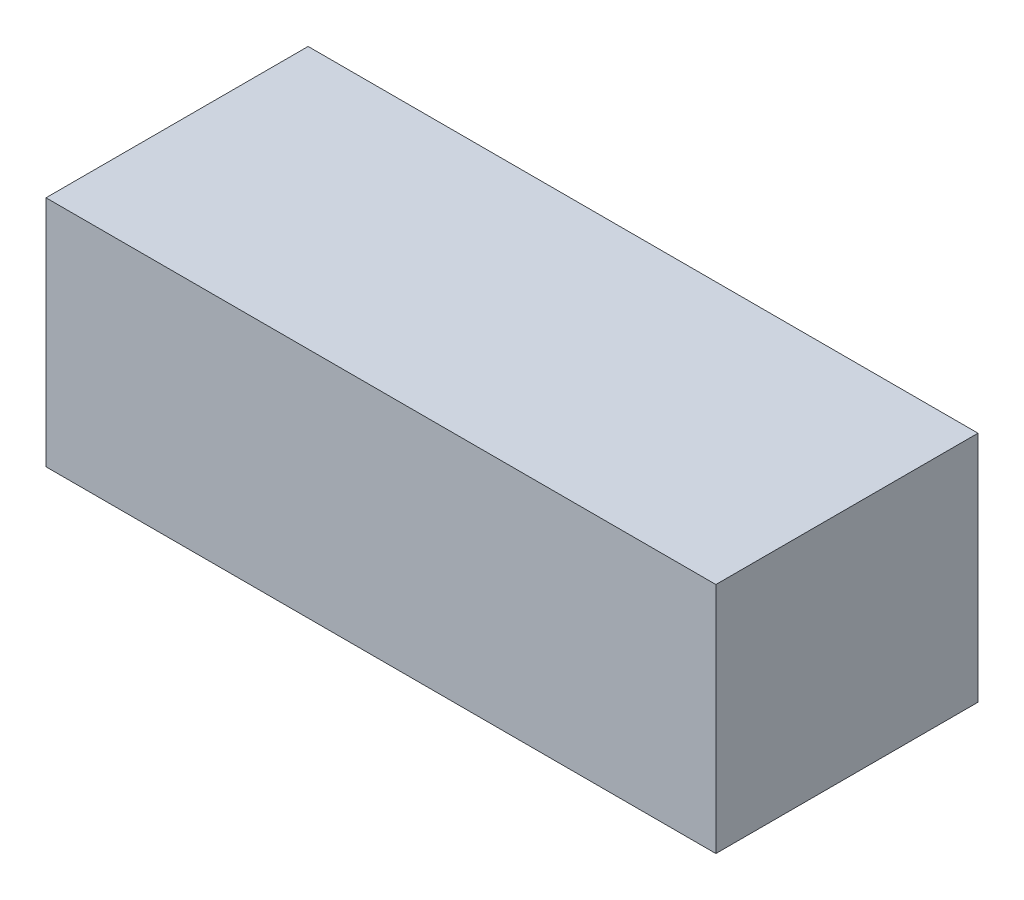
ISO-10303-21;
HEADER;
FILE_DESCRIPTION(('STEP AP214'),'2;1');
FILE_NAME('part.step','',(''),(''),'','','');
FILE_SCHEMA(('AUTOMOTIVE_DESIGN { 1 0 10303 214 1 1 1 1 }'));
ENDSEC;
DATA;
#1=APPLICATION_CONTEXT('core data for automotive mechanical design processes');
#2=APPLICATION_PROTOCOL_DEFINITION('international standard','automotive_design',2000,#1);
#3=PRODUCT_CONTEXT('',#1,'mechanical');
#4=PRODUCT('Part','Part','',(#3));
#5=PRODUCT_RELATED_PRODUCT_CATEGORY('part','',(#4));
#6=PRODUCT_DEFINITION_FORMATION('','',#4);
#7=PRODUCT_DEFINITION_CONTEXT('part definition',#1,'design');
#8=PRODUCT_DEFINITION('design','',#6,#7);
#9=PRODUCT_DEFINITION_SHAPE('','',#8);
#10=(LENGTH_UNIT() NAMED_UNIT(*) SI_UNIT(.MILLI.,.METRE.));
#11=(NAMED_UNIT(*) PLANE_ANGLE_UNIT() SI_UNIT($,.RADIAN.));
#12=(NAMED_UNIT(*) SI_UNIT($,.STERADIAN.) SOLID_ANGLE_UNIT());
#13=UNCERTAINTY_MEASURE_WITH_UNIT(LENGTH_MEASURE(1.E-05),#10,'distance_accuracy_value','');
#14=(GEOMETRIC_REPRESENTATION_CONTEXT(3) GLOBAL_UNCERTAINTY_ASSIGNED_CONTEXT((#13)) GLOBAL_UNIT_ASSIGNED_CONTEXT((#10,
#11,#12)) REPRESENTATION_CONTEXT('',''));
#15=CARTESIAN_POINT('',(0.,0.,0.));
#16=DIRECTION('',(0.,0.,1.));
#17=DIRECTION('',(1.,0.,0.));
#18=AXIS2_PLACEMENT_3D('',#15,#16,#17);
#19=CARTESIAN_POINT('',(-23.,16.,-9.));
#20=DIRECTION('',(1.,0.,0.));
#21=DIRECTION('',(0.,0.,-1.));
#22=AXIS2_PLACEMENT_3D('',#19,#20,#21);
#23=PLANE('',#22);
#24=DIRECTION('',(0.,0.,1.));
#25=VECTOR('',#24,1.);
#26=CARTESIAN_POINT('',(-23.,0.,-9.));
#27=LINE('',#26,#25);
#28=CARTESIAN_POINT('',(-23.,0.,-9.));
#29=VERTEX_POINT('',#28);
#30=CARTESIAN_POINT('',(-23.,0.,9.));
#31=VERTEX_POINT('',#30);
#32=EDGE_CURVE('E113',#29,#31,#27,.T.);
#33=ORIENTED_EDGE('',*,*,#32,.T.);
#34=DIRECTION('',(0.,-1.,0.));
#35=VECTOR('',#34,1.);
#36=CARTESIAN_POINT('',(-23.,16.,9.));
#37=LINE('',#36,#35);
#38=CARTESIAN_POINT('',(-23.,16.,9.));
#39=VERTEX_POINT('',#38);
#40=EDGE_CURVE('E11',#39,#31,#37,.T.);
#41=ORIENTED_EDGE('',*,*,#40,.F.);
#42=DIRECTION('',(0.,0.,1.));
#43=VECTOR('',#42,1.);
#44=CARTESIAN_POINT('',(-23.,16.,-9.));
#45=LINE('',#44,#43);
#46=CARTESIAN_POINT('',(-23.,16.,-9.));
#47=VERTEX_POINT('',#46);
#48=EDGE_CURVE('E97',#47,#39,#45,.T.);
#49=ORIENTED_EDGE('',*,*,#48,.F.);
#50=DIRECTION('',(0.,-1.,0.));
#51=VECTOR('',#50,1.);
#52=CARTESIAN_POINT('',(-23.,16.,-9.));
#53=LINE('',#52,#51);
#54=EDGE_CURVE('E109',#47,#29,#53,.T.);
#55=ORIENTED_EDGE('',*,*,#54,.T.);
#56=EDGE_LOOP('',(#33,#41,#49,#55));
#57=FACE_BOUND('',#56,.T.);
#58=ADVANCED_FACE('F45',(#57),#23,.F.);
#59=CARTESIAN_POINT('',(-23.,16.,9.));
#60=DIRECTION('',(0.,0.,-1.));
#61=DIRECTION('',(-1.,0.,0.));
#62=AXIS2_PLACEMENT_3D('',#59,#60,#61);
#63=PLANE('',#62);
#64=DIRECTION('',(1.,0.,0.));
#65=VECTOR('',#64,1.);
#66=CARTESIAN_POINT('',(-23.,0.,9.));
#67=LINE('',#66,#65);
#68=CARTESIAN_POINT('',(23.,0.,9.));
#69=VERTEX_POINT('',#68);
#70=EDGE_CURVE('E102',#31,#69,#67,.T.);
#71=ORIENTED_EDGE('',*,*,#70,.T.);
#72=DIRECTION('',(0.,-1.,0.));
#73=VECTOR('',#72,1.);
#74=CARTESIAN_POINT('',(23.,16.,9.));
#75=LINE('',#74,#73);
#76=CARTESIAN_POINT('',(23.,16.,9.));
#77=VERTEX_POINT('',#76);
#78=EDGE_CURVE('E54',#77,#69,#75,.T.);
#79=ORIENTED_EDGE('',*,*,#78,.F.);
#80=DIRECTION('',(1.,0.,0.));
#81=VECTOR('',#80,1.);
#82=CARTESIAN_POINT('',(-23.,16.,9.));
#83=LINE('',#82,#81);
#84=EDGE_CURVE('E92',#39,#77,#83,.T.);
#85=ORIENTED_EDGE('',*,*,#84,.F.);
#86=ORIENTED_EDGE('',*,*,#40,.T.);
#87=EDGE_LOOP('',(#71,#79,#85,#86));
#88=FACE_BOUND('',#87,.T.);
#89=ADVANCED_FACE('F101',(#88),#63,.F.);
#90=CARTESIAN_POINT('',(23.,16.,-9.));
#91=DIRECTION('',(-1.,0.,0.));
#92=DIRECTION('',(0.,0.,1.));
#93=AXIS2_PLACEMENT_3D('',#90,#91,#92);
#94=PLANE('',#93);
#95=DIRECTION('',(0.,0.,-1.));
#96=VECTOR('',#95,1.);
#97=CARTESIAN_POINT('',(23.,0.,-9.));
#98=LINE('',#97,#96);
#99=CARTESIAN_POINT('',(23.,0.,-9.));
#100=VERTEX_POINT('',#99);
#101=EDGE_CURVE('E79',#69,#100,#98,.T.);
#102=ORIENTED_EDGE('',*,*,#101,.T.);
#103=DIRECTION('',(0.,-1.,0.));
#104=VECTOR('',#103,1.);
#105=CARTESIAN_POINT('',(23.,16.,-9.));
#106=LINE('',#105,#104);
#107=CARTESIAN_POINT('',(23.,16.,-9.));
#108=VERTEX_POINT('',#107);
#109=EDGE_CURVE('E104',#108,#100,#106,.T.);
#110=ORIENTED_EDGE('',*,*,#109,.F.);
#111=DIRECTION('',(0.,0.,-1.));
#112=VECTOR('',#111,1.);
#113=CARTESIAN_POINT('',(23.,16.,-9.));
#114=LINE('',#113,#112);
#115=EDGE_CURVE('E95',#77,#108,#114,.T.);
#116=ORIENTED_EDGE('',*,*,#115,.F.);
#117=ORIENTED_EDGE('',*,*,#78,.T.);
#118=EDGE_LOOP('',(#102,#110,#116,#117));
#119=FACE_BOUND('',#118,.T.);
#120=ADVANCED_FACE('F105',(#119),#94,.F.);
#121=CARTESIAN_POINT('',(-23.,16.,-9.));
#122=DIRECTION('',(0.,0.,1.));
#123=DIRECTION('',(1.,0.,0.));
#124=AXIS2_PLACEMENT_3D('',#121,#122,#123);
#125=PLANE('',#124);
#126=DIRECTION('',(-1.,0.,0.));
#127=VECTOR('',#126,1.);
#128=CARTESIAN_POINT('',(-23.,0.,-9.));
#129=LINE('',#128,#127);
#130=EDGE_CURVE('E85',#100,#29,#129,.T.);
#131=ORIENTED_EDGE('',*,*,#130,.T.);
#132=ORIENTED_EDGE('',*,*,#54,.F.);
#133=DIRECTION('',(-1.,0.,0.));
#134=VECTOR('',#133,1.);
#135=CARTESIAN_POINT('',(-23.,16.,-9.));
#136=LINE('',#135,#134);
#137=EDGE_CURVE('E62',#108,#47,#136,.T.);
#138=ORIENTED_EDGE('',*,*,#137,.F.);
#139=ORIENTED_EDGE('',*,*,#109,.T.);
#140=EDGE_LOOP('',(#131,#132,#138,#139));
#141=FACE_BOUND('',#140,.T.);
#142=ADVANCED_FACE('F126',(#141),#125,.F.);
#143=CARTESIAN_POINT('',(0.,16.,0.));
#144=DIRECTION('',(0.,1.,0.));
#145=DIRECTION('',(0.,0.,1.));
#146=AXIS2_PLACEMENT_3D('',#143,#144,#145);
#147=PLANE('',#146);
#148=ORIENTED_EDGE('',*,*,#48,.T.);
#149=ORIENTED_EDGE('',*,*,#84,.T.);
#150=ORIENTED_EDGE('',*,*,#115,.T.);
#151=ORIENTED_EDGE('',*,*,#137,.T.);
#152=EDGE_LOOP('',(#148,#149,#150,#151));
#153=FACE_BOUND('',#152,.T.);
#154=ADVANCED_FACE('F93',(#153),#147,.T.);
#155=CARTESIAN_POINT('',(0.,0.,0.));
#156=DIRECTION('',(0.,1.,0.));
#157=DIRECTION('',(0.,0.,1.));
#158=AXIS2_PLACEMENT_3D('',#155,#156,#157);
#159=PLANE('',#158);
#160=ORIENTED_EDGE('',*,*,#32,.F.);
#161=ORIENTED_EDGE('',*,*,#130,.F.);
#162=ORIENTED_EDGE('',*,*,#101,.F.);
#163=ORIENTED_EDGE('',*,*,#70,.F.);
#164=EDGE_LOOP('',(#160,#161,#162,#163));
#165=FACE_BOUND('',#164,.T.);
#166=ADVANCED_FACE('F129',(#165),#159,.F.);
#167=CLOSED_SHELL('',(#58,#89,#120,#142,#154,#166));
#168=MANIFOLD_SOLID_BREP('B2',#167);
#169=ADVANCED_BREP_SHAPE_REPRESENTATION('',(#18,#168),#14);
#170=SHAPE_DEFINITION_REPRESENTATION(#9,#169);
ENDSEC;
END-ISO-10303-21;
